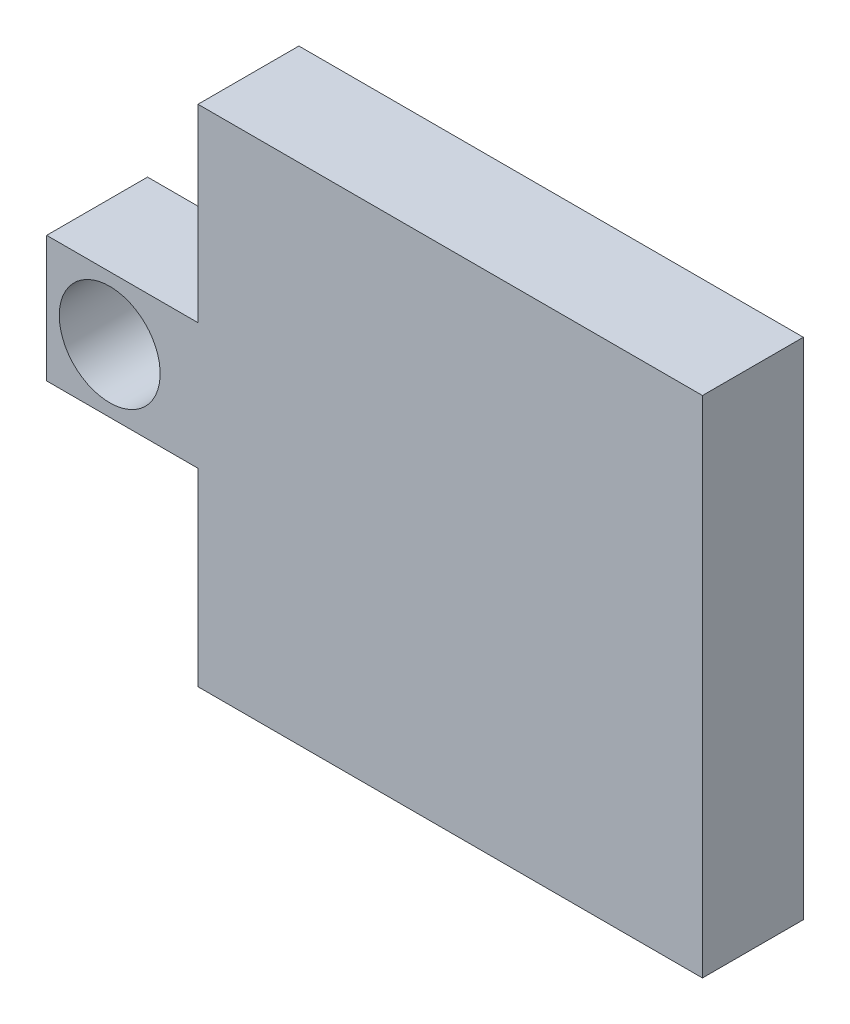
ISO-10303-21;
HEADER;
FILE_DESCRIPTION(('STEP AP214'),'2;1');
FILE_NAME('part.step','',(''),(''),'','','');
FILE_SCHEMA(('AUTOMOTIVE_DESIGN { 1 0 10303 214 1 1 1 1 }'));
ENDSEC;
DATA;
#1=APPLICATION_CONTEXT('core data for automotive mechanical design processes');
#2=APPLICATION_PROTOCOL_DEFINITION('international standard','automotive_design',2000,#1);
#3=PRODUCT_CONTEXT('',#1,'mechanical');
#4=PRODUCT('Part','Part','',(#3));
#5=PRODUCT_RELATED_PRODUCT_CATEGORY('part','',(#4));
#6=PRODUCT_DEFINITION_FORMATION('','',#4);
#7=PRODUCT_DEFINITION_CONTEXT('part definition',#1,'design');
#8=PRODUCT_DEFINITION('design','',#6,#7);
#9=PRODUCT_DEFINITION_SHAPE('','',#8);
#10=(LENGTH_UNIT() NAMED_UNIT(*) SI_UNIT(.MILLI.,.METRE.));
#11=(NAMED_UNIT(*) PLANE_ANGLE_UNIT() SI_UNIT($,.RADIAN.));
#12=(NAMED_UNIT(*) SI_UNIT($,.STERADIAN.) SOLID_ANGLE_UNIT());
#13=UNCERTAINTY_MEASURE_WITH_UNIT(LENGTH_MEASURE(1.E-05),#10,'distance_accuracy_value','');
#14=(GEOMETRIC_REPRESENTATION_CONTEXT(3) GLOBAL_UNCERTAINTY_ASSIGNED_CONTEXT((#13)) GLOBAL_UNIT_ASSIGNED_CONTEXT((#10,
#11,#12)) REPRESENTATION_CONTEXT('',''));
#15=CARTESIAN_POINT('',(0.,0.,0.));
#16=DIRECTION('',(0.,0.,1.));
#17=DIRECTION('',(1.,0.,0.));
#18=AXIS2_PLACEMENT_3D('',#15,#16,#17);
#19=CARTESIAN_POINT('',(-25.,-25.,10.));
#20=DIRECTION('',(1.,0.,0.));
#21=DIRECTION('',(0.,0.,-1.));
#22=AXIS2_PLACEMENT_3D('',#19,#20,#21);
#23=PLANE('',#22);
#24=DIRECTION('',(0.,0.,-1.));
#25=VECTOR('',#24,1.);
#26=CARTESIAN_POINT('',(-25.,6.25,10.));
#27=LINE('',#26,#25);
#28=CARTESIAN_POINT('',(-25.,6.25,10.));
#29=VERTEX_POINT('',#28);
#30=CARTESIAN_POINT('',(-25.,6.25,0.));
#31=VERTEX_POINT('',#30);
#32=EDGE_CURVE('E54',#29,#31,#27,.T.);
#33=ORIENTED_EDGE('',*,*,#32,.F.);
#34=DIRECTION('',(0.,-1.,0.));
#35=VECTOR('',#34,1.);
#36=CARTESIAN_POINT('',(-25.,-25.,10.));
#37=LINE('',#36,#35);
#38=CARTESIAN_POINT('',(-25.,25.,10.));
#39=VERTEX_POINT('',#38);
#40=EDGE_CURVE('E145',#39,#29,#37,.T.);
#41=ORIENTED_EDGE('',*,*,#40,.F.);
#42=DIRECTION('',(0.,0.,-1.));
#43=VECTOR('',#42,1.);
#44=CARTESIAN_POINT('',(-25.,25.,10.));
#45=LINE('',#44,#43);
#46=CARTESIAN_POINT('',(-25.,25.,0.));
#47=VERTEX_POINT('',#46);
#48=EDGE_CURVE('E47',#39,#47,#45,.T.);
#49=ORIENTED_EDGE('',*,*,#48,.T.);
#50=DIRECTION('',(0.,-1.,0.));
#51=VECTOR('',#50,1.);
#52=CARTESIAN_POINT('',(-25.,-25.,0.));
#53=LINE('',#52,#51);
#54=EDGE_CURVE('E151',#47,#31,#53,.T.);
#55=ORIENTED_EDGE('',*,*,#54,.T.);
#56=EDGE_LOOP('',(#33,#41,#49,#55));
#57=FACE_BOUND('',#56,.T.);
#58=ADVANCED_FACE('F39',(#57),#23,.F.);
#59=DIRECTION('',(0.,0.,1.));
#60=VECTOR('',#59,1.);
#61=CARTESIAN_POINT('',(-25.,-6.25,10.));
#62=LINE('',#61,#60);
#63=CARTESIAN_POINT('',(-25.,-6.25,0.));
#64=VERTEX_POINT('',#63);
#65=CARTESIAN_POINT('',(-25.,-6.25,10.));
#66=VERTEX_POINT('',#65);
#67=EDGE_CURVE('E62',#64,#66,#62,.T.);
#68=ORIENTED_EDGE('',*,*,#67,.F.);
#69=CARTESIAN_POINT('',(-25.,-25.,0.));
#70=VERTEX_POINT('',#69);
#71=EDGE_CURVE('E128',#64,#70,#53,.T.);
#72=ORIENTED_EDGE('',*,*,#71,.T.);
#73=DIRECTION('',(0.,0.,-1.));
#74=VECTOR('',#73,1.);
#75=CARTESIAN_POINT('',(-25.,-25.,10.));
#76=LINE('',#75,#74);
#77=CARTESIAN_POINT('',(-25.,-25.,10.));
#78=VERTEX_POINT('',#77);
#79=EDGE_CURVE('E156',#78,#70,#76,.T.);
#80=ORIENTED_EDGE('',*,*,#79,.F.);
#81=EDGE_CURVE('E144',#66,#78,#37,.T.);
#82=ORIENTED_EDGE('',*,*,#81,.F.);
#83=EDGE_LOOP('',(#68,#72,#80,#82));
#84=FACE_BOUND('',#83,.T.);
#85=ADVANCED_FACE('F199',(#84),#23,.F.);
#86=CARTESIAN_POINT('',(25.,-25.,10.));
#87=DIRECTION('',(-1.,0.,0.));
#88=DIRECTION('',(0.,0.,1.));
#89=AXIS2_PLACEMENT_3D('',#86,#87,#88);
#90=PLANE('',#89);
#91=DIRECTION('',(0.,1.,0.));
#92=VECTOR('',#91,1.);
#93=CARTESIAN_POINT('',(25.,-25.,0.));
#94=LINE('',#93,#92);
#95=CARTESIAN_POINT('',(25.,-25.,0.));
#96=VERTEX_POINT('',#95);
#97=CARTESIAN_POINT('',(25.,25.,0.));
#98=VERTEX_POINT('',#97);
#99=EDGE_CURVE('E129',#96,#98,#94,.T.);
#100=ORIENTED_EDGE('',*,*,#99,.T.);
#101=DIRECTION('',(0.,0.,-1.));
#102=VECTOR('',#101,1.);
#103=CARTESIAN_POINT('',(25.,25.,10.));
#104=LINE('',#103,#102);
#105=CARTESIAN_POINT('',(25.,25.,10.));
#106=VERTEX_POINT('',#105);
#107=EDGE_CURVE('E11',#106,#98,#104,.T.);
#108=ORIENTED_EDGE('',*,*,#107,.F.);
#109=DIRECTION('',(0.,1.,0.));
#110=VECTOR('',#109,1.);
#111=CARTESIAN_POINT('',(25.,-25.,10.));
#112=LINE('',#111,#110);
#113=CARTESIAN_POINT('',(25.,-25.,10.));
#114=VERTEX_POINT('',#113);
#115=EDGE_CURVE('E138',#114,#106,#112,.T.);
#116=ORIENTED_EDGE('',*,*,#115,.F.);
#117=DIRECTION('',(0.,0.,-1.));
#118=VECTOR('',#117,1.);
#119=CARTESIAN_POINT('',(25.,-25.,10.));
#120=LINE('',#119,#118);
#121=EDGE_CURVE('E148',#114,#96,#120,.T.);
#122=ORIENTED_EDGE('',*,*,#121,.T.);
#123=EDGE_LOOP('',(#100,#108,#116,#122));
#124=FACE_BOUND('',#123,.T.);
#125=ADVANCED_FACE('F41',(#124),#90,.F.);
#126=CARTESIAN_POINT('',(-25.,25.,10.));
#127=DIRECTION('',(0.,-1.,0.));
#128=DIRECTION('',(0.,0.,-1.));
#129=AXIS2_PLACEMENT_3D('',#126,#127,#128);
#130=PLANE('',#129);
#131=DIRECTION('',(-1.,0.,0.));
#132=VECTOR('',#131,1.);
#133=CARTESIAN_POINT('',(-25.,25.,0.));
#134=LINE('',#133,#132);
#135=EDGE_CURVE('E132',#98,#47,#134,.T.);
#136=ORIENTED_EDGE('',*,*,#135,.T.);
#137=ORIENTED_EDGE('',*,*,#48,.F.);
#138=DIRECTION('',(-1.,0.,0.));
#139=VECTOR('',#138,1.);
#140=CARTESIAN_POINT('',(-25.,25.,10.));
#141=LINE('',#140,#139);
#142=EDGE_CURVE('E141',#106,#39,#141,.T.);
#143=ORIENTED_EDGE('',*,*,#142,.F.);
#144=ORIENTED_EDGE('',*,*,#107,.T.);
#145=EDGE_LOOP('',(#136,#137,#143,#144));
#146=FACE_BOUND('',#145,.T.);
#147=ADVANCED_FACE('F204',(#146),#130,.F.);
#148=CARTESIAN_POINT('',(-25.,-25.,10.));
#149=DIRECTION('',(0.,1.,0.));
#150=DIRECTION('',(0.,0.,1.));
#151=AXIS2_PLACEMENT_3D('',#148,#149,#150);
#152=PLANE('',#151);
#153=DIRECTION('',(1.,0.,0.));
#154=VECTOR('',#153,1.);
#155=CARTESIAN_POINT('',(-25.,-25.,0.));
#156=LINE('',#155,#154);
#157=EDGE_CURVE('E142',#70,#96,#156,.T.);
#158=ORIENTED_EDGE('',*,*,#157,.T.);
#159=ORIENTED_EDGE('',*,*,#121,.F.);
#160=DIRECTION('',(1.,0.,0.));
#161=VECTOR('',#160,1.);
#162=CARTESIAN_POINT('',(-25.,-25.,10.));
#163=LINE('',#162,#161);
#164=EDGE_CURVE('E147',#78,#114,#163,.T.);
#165=ORIENTED_EDGE('',*,*,#164,.F.);
#166=ORIENTED_EDGE('',*,*,#79,.T.);
#167=EDGE_LOOP('',(#158,#159,#165,#166));
#168=FACE_BOUND('',#167,.T.);
#169=ADVANCED_FACE('F195',(#168),#152,.F.);
#170=CARTESIAN_POINT('',(0.,0.,10.));
#171=DIRECTION('',(0.,0.,-1.));
#172=DIRECTION('',(-1.,0.,0.));
#173=AXIS2_PLACEMENT_3D('',#170,#171,#172);
#174=PLANE('',#173);
#175=CARTESIAN_POINT('',(-33.75,0.,10.));
#176=DIRECTION('',(0.,0.,-1.));
#177=DIRECTION('',(-1.,0.,0.));
#178=AXIS2_PLACEMENT_3D('',#175,#176,#177);
#179=CIRCLE('',#178,5.);
#180=CARTESIAN_POINT('',(-38.75,0.,10.));
#181=VERTEX_POINT('',#180);
#182=EDGE_CURVE('E169',#181,#181,#179,.T.);
#183=ORIENTED_EDGE('',*,*,#182,.T.);
#184=EDGE_LOOP('',(#183));
#185=FACE_BOUND('',#184,.T.);
#186=ORIENTED_EDGE('',*,*,#115,.T.);
#187=ORIENTED_EDGE('',*,*,#142,.T.);
#188=ORIENTED_EDGE('',*,*,#40,.T.);
#189=DIRECTION('',(1.,0.,0.));
#190=VECTOR('',#189,1.);
#191=CARTESIAN_POINT('',(-40.,6.25,10.));
#192=LINE('',#191,#190);
#193=CARTESIAN_POINT('',(-40.,6.25,10.));
#194=VERTEX_POINT('',#193);
#195=EDGE_CURVE('E134',#194,#29,#192,.T.);
#196=ORIENTED_EDGE('',*,*,#195,.F.);
#197=DIRECTION('',(0.,1.,0.));
#198=VECTOR('',#197,1.);
#199=CARTESIAN_POINT('',(-40.,-6.25,10.));
#200=LINE('',#199,#198);
#201=CARTESIAN_POINT('',(-40.,-6.25,10.));
#202=VERTEX_POINT('',#201);
#203=EDGE_CURVE('E114',#202,#194,#200,.T.);
#204=ORIENTED_EDGE('',*,*,#203,.F.);
#205=DIRECTION('',(1.,0.,0.));
#206=VECTOR('',#205,1.);
#207=CARTESIAN_POINT('',(-40.,-6.25,10.));
#208=LINE('',#207,#206);
#209=EDGE_CURVE('E111',#202,#66,#208,.T.);
#210=ORIENTED_EDGE('',*,*,#209,.T.);
#211=ORIENTED_EDGE('',*,*,#81,.T.);
#212=ORIENTED_EDGE('',*,*,#164,.T.);
#213=EDGE_LOOP('',(#186,#187,#188,#196,#204,#210,#211,#212));
#214=FACE_BOUND('',#213,.T.);
#215=ADVANCED_FACE('F178',(#185,#214),#174,.F.);
#216=CARTESIAN_POINT('',(0.,0.,0.));
#217=DIRECTION('',(0.,0.,-1.));
#218=DIRECTION('',(-1.,0.,0.));
#219=AXIS2_PLACEMENT_3D('',#216,#217,#218);
#220=PLANE('',#219);
#221=CARTESIAN_POINT('',(-33.75,0.,0.));
#222=DIRECTION('',(0.,0.,-1.));
#223=DIRECTION('',(-1.,0.,0.));
#224=AXIS2_PLACEMENT_3D('',#221,#222,#223);
#225=CIRCLE('',#224,5.);
#226=CARTESIAN_POINT('',(-38.75,0.,0.));
#227=VERTEX_POINT('',#226);
#228=EDGE_CURVE('E172',#227,#227,#225,.T.);
#229=ORIENTED_EDGE('',*,*,#228,.F.);
#230=EDGE_LOOP('',(#229));
#231=FACE_BOUND('',#230,.T.);
#232=ORIENTED_EDGE('',*,*,#99,.F.);
#233=ORIENTED_EDGE('',*,*,#157,.F.);
#234=ORIENTED_EDGE('',*,*,#71,.F.);
#235=DIRECTION('',(1.,0.,0.));
#236=VECTOR('',#235,1.);
#237=CARTESIAN_POINT('',(-40.,-6.25,0.));
#238=LINE('',#237,#236);
#239=CARTESIAN_POINT('',(-40.,-6.25,0.));
#240=VERTEX_POINT('',#239);
#241=EDGE_CURVE('E109',#240,#64,#238,.T.);
#242=ORIENTED_EDGE('',*,*,#241,.F.);
#243=DIRECTION('',(0.,-1.,0.));
#244=VECTOR('',#243,1.);
#245=CARTESIAN_POINT('',(-40.,-6.25,0.));
#246=LINE('',#245,#244);
#247=CARTESIAN_POINT('',(-40.,6.25,0.));
#248=VERTEX_POINT('',#247);
#249=EDGE_CURVE('E115',#248,#240,#246,.T.);
#250=ORIENTED_EDGE('',*,*,#249,.F.);
#251=DIRECTION('',(1.,0.,0.));
#252=VECTOR('',#251,1.);
#253=CARTESIAN_POINT('',(-40.,6.25,0.));
#254=LINE('',#253,#252);
#255=EDGE_CURVE('E162',#248,#31,#254,.T.);
#256=ORIENTED_EDGE('',*,*,#255,.T.);
#257=ORIENTED_EDGE('',*,*,#54,.F.);
#258=ORIENTED_EDGE('',*,*,#135,.F.);
#259=EDGE_LOOP('',(#232,#233,#234,#242,#250,#256,#257,#258));
#260=FACE_BOUND('',#259,.T.);
#261=ADVANCED_FACE('F126',(#231,#260),#220,.T.);
#262=CARTESIAN_POINT('',(-40.,-6.25,10.));
#263=DIRECTION('',(0.,1.,0.));
#264=DIRECTION('',(0.,0.,1.));
#265=AXIS2_PLACEMENT_3D('',#262,#263,#264);
#266=PLANE('',#265);
#267=ORIENTED_EDGE('',*,*,#67,.T.);
#268=ORIENTED_EDGE('',*,*,#209,.F.);
#269=DIRECTION('',(0.,0.,1.));
#270=VECTOR('',#269,1.);
#271=CARTESIAN_POINT('',(-40.,-6.25,10.));
#272=LINE('',#271,#270);
#273=EDGE_CURVE('E105',#240,#202,#272,.T.);
#274=ORIENTED_EDGE('',*,*,#273,.F.);
#275=ORIENTED_EDGE('',*,*,#241,.T.);
#276=EDGE_LOOP('',(#267,#268,#274,#275));
#277=FACE_BOUND('',#276,.T.);
#278=ADVANCED_FACE('F107',(#277),#266,.F.);
#279=CARTESIAN_POINT('',(-40.,6.25,10.));
#280=DIRECTION('',(0.,-1.,0.));
#281=DIRECTION('',(0.,0.,-1.));
#282=AXIS2_PLACEMENT_3D('',#279,#280,#281);
#283=PLANE('',#282);
#284=ORIENTED_EDGE('',*,*,#32,.T.);
#285=ORIENTED_EDGE('',*,*,#255,.F.);
#286=DIRECTION('',(0.,0.,-1.));
#287=VECTOR('',#286,1.);
#288=CARTESIAN_POINT('',(-40.,6.25,10.));
#289=LINE('',#288,#287);
#290=EDGE_CURVE('E120',#194,#248,#289,.T.);
#291=ORIENTED_EDGE('',*,*,#290,.F.);
#292=ORIENTED_EDGE('',*,*,#195,.T.);
#293=EDGE_LOOP('',(#284,#285,#291,#292));
#294=FACE_BOUND('',#293,.T.);
#295=ADVANCED_FACE('F193',(#294),#283,.F.);
#296=CARTESIAN_POINT('',(-40.,0.,0.));
#297=DIRECTION('',(-1.,0.,0.));
#298=DIRECTION('',(0.,0.,1.));
#299=AXIS2_PLACEMENT_3D('',#296,#297,#298);
#300=PLANE('',#299);
#301=ORIENTED_EDGE('',*,*,#249,.T.);
#302=ORIENTED_EDGE('',*,*,#273,.T.);
#303=ORIENTED_EDGE('',*,*,#203,.T.);
#304=ORIENTED_EDGE('',*,*,#290,.T.);
#305=EDGE_LOOP('',(#301,#302,#303,#304));
#306=FACE_BOUND('',#305,.T.);
#307=ADVANCED_FACE('F118',(#306),#300,.T.);
#308=CARTESIAN_POINT('',(-33.75,0.,10.));
#309=DIRECTION('',(0.,0.,-1.));
#310=DIRECTION('',(-1.,0.,0.));
#311=AXIS2_PLACEMENT_3D('',#308,#309,#310);
#312=CYLINDRICAL_SURFACE('',#311,5.);
#313=ORIENTED_EDGE('',*,*,#182,.F.);
#314=EDGE_LOOP('',(#313));
#315=FACE_BOUND('',#314,.T.);
#316=ORIENTED_EDGE('',*,*,#228,.T.);
#317=EDGE_LOOP('',(#316));
#318=FACE_BOUND('',#317,.T.);
#319=ADVANCED_FACE('F181',(#315,#318),#312,.F.);
#320=CLOSED_SHELL('',(#58,#85,#125,#147,#169,#215,#261,#278,#295,#307,#319));
#321=MANIFOLD_SOLID_BREP('B2',#320);
#322=ADVANCED_BREP_SHAPE_REPRESENTATION('',(#18,#321),#14);
#323=SHAPE_DEFINITION_REPRESENTATION(#9,#322);
ENDSEC;
END-ISO-10303-21;
